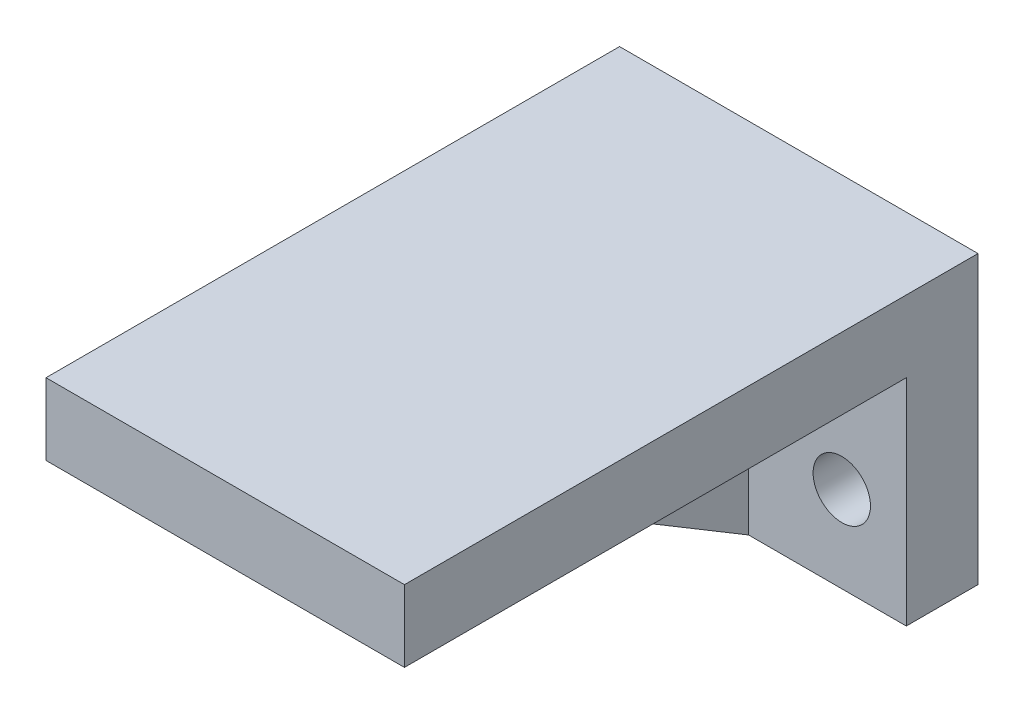
ISO-10303-21;
HEADER;
FILE_DESCRIPTION(('STEP AP214'),'2;1');
FILE_NAME('part.step','',(''),(''),'','','');
FILE_SCHEMA(('AUTOMOTIVE_DESIGN { 1 0 10303 214 1 1 1 1 }'));
ENDSEC;
DATA;
#1=APPLICATION_CONTEXT('core data for automotive mechanical design processes');
#2=APPLICATION_PROTOCOL_DEFINITION('international standard','automotive_design',2000,#1);
#3=PRODUCT_CONTEXT('',#1,'mechanical');
#4=PRODUCT('Part','Part','',(#3));
#5=PRODUCT_RELATED_PRODUCT_CATEGORY('part','',(#4));
#6=PRODUCT_DEFINITION_FORMATION('','',#4);
#7=PRODUCT_DEFINITION_CONTEXT('part definition',#1,'design');
#8=PRODUCT_DEFINITION('design','',#6,#7);
#9=PRODUCT_DEFINITION_SHAPE('','',#8);
#10=(LENGTH_UNIT() NAMED_UNIT(*) SI_UNIT(.MILLI.,.METRE.));
#11=(NAMED_UNIT(*) PLANE_ANGLE_UNIT() SI_UNIT($,.RADIAN.));
#12=(NAMED_UNIT(*) SI_UNIT($,.STERADIAN.) SOLID_ANGLE_UNIT());
#13=UNCERTAINTY_MEASURE_WITH_UNIT(LENGTH_MEASURE(1.E-05),#10,'distance_accuracy_value','');
#14=(GEOMETRIC_REPRESENTATION_CONTEXT(3) GLOBAL_UNCERTAINTY_ASSIGNED_CONTEXT((#13)) GLOBAL_UNIT_ASSIGNED_CONTEXT((#10,
#11,#12)) REPRESENTATION_CONTEXT('',''));
#15=CARTESIAN_POINT('',(0.,0.,0.));
#16=DIRECTION('',(0.,0.,1.));
#17=DIRECTION('',(1.,0.,0.));
#18=AXIS2_PLACEMENT_3D('',#15,#16,#17);
#19=CARTESIAN_POINT('',(12.5,-5.00000000000001,40.));
#20=DIRECTION('',(0.,1.,0.));
#21=DIRECTION('',(0.,0.,1.));
#22=AXIS2_PLACEMENT_3D('',#19,#20,#21);
#23=PLANE('',#22);
#24=DIRECTION('',(0.,0.,1.));
#25=VECTOR('',#24,1.);
#26=CARTESIAN_POINT('',(1.5,-5.00000000000001,5.));
#27=LINE('',#26,#25);
#28=CARTESIAN_POINT('',(1.5,-5.00000000000001,5.));
#29=VERTEX_POINT('',#28);
#30=CARTESIAN_POINT('',(1.5,-5.00000000000001,30.));
#31=VERTEX_POINT('',#30);
#32=EDGE_CURVE('E119',#29,#31,#27,.T.);
#33=ORIENTED_EDGE('',*,*,#32,.F.);
#34=DIRECTION('',(-1.,0.,0.));
#35=VECTOR('',#34,1.);
#36=CARTESIAN_POINT('',(12.5,-5.00000000000001,5.));
#37=LINE('',#36,#35);
#38=CARTESIAN_POINT('',(12.5,-5.00000000000001,5.));
#39=VERTEX_POINT('',#38);
#40=EDGE_CURVE('E116',#39,#29,#37,.T.);
#41=ORIENTED_EDGE('',*,*,#40,.F.);
#42=DIRECTION('',(0.,0.,-1.));
#43=VECTOR('',#42,1.);
#44=CARTESIAN_POINT('',(12.5,-5.00000000000001,40.));
#45=LINE('',#44,#43);
#46=CARTESIAN_POINT('',(12.5,-5.00000000000001,40.));
#47=VERTEX_POINT('',#46);
#48=EDGE_CURVE('E102',#47,#39,#45,.T.);
#49=ORIENTED_EDGE('',*,*,#48,.F.);
#50=DIRECTION('',(-1.,0.,0.));
#51=VECTOR('',#50,1.);
#52=CARTESIAN_POINT('',(12.5,-5.00000000000001,40.));
#53=LINE('',#52,#51);
#54=CARTESIAN_POINT('',(-12.5,-5.00000000000001,40.));
#55=VERTEX_POINT('',#54);
#56=EDGE_CURVE('E122',#47,#55,#53,.T.);
#57=ORIENTED_EDGE('',*,*,#56,.T.);
#58=DIRECTION('',(0.,0.,-1.));
#59=VECTOR('',#58,1.);
#60=CARTESIAN_POINT('',(-12.5,-5.00000000000001,40.));
#61=LINE('',#60,#59);
#62=CARTESIAN_POINT('',(-12.5,-5.00000000000001,5.));
#63=VERTEX_POINT('',#62);
#64=EDGE_CURVE('E141',#55,#63,#61,.T.);
#65=ORIENTED_EDGE('',*,*,#64,.T.);
#66=CARTESIAN_POINT('',(-1.5,-5.00000000000001,5.));
#67=VERTEX_POINT('',#66);
#68=EDGE_CURVE('E123',#67,#63,#37,.T.);
#69=ORIENTED_EDGE('',*,*,#68,.F.);
#70=DIRECTION('',(0.,0.,1.));
#71=VECTOR('',#70,1.);
#72=CARTESIAN_POINT('',(-1.5,-5.00000000000001,5.));
#73=LINE('',#72,#71);
#74=CARTESIAN_POINT('',(-1.5,-5.00000000000001,30.));
#75=VERTEX_POINT('',#74);
#76=EDGE_CURVE('E164',#67,#75,#73,.T.);
#77=ORIENTED_EDGE('',*,*,#76,.T.);
#78=DIRECTION('',(-1.,0.,0.));
#79=VECTOR('',#78,1.);
#80=CARTESIAN_POINT('',(1.5,-5.00000000000001,30.));
#81=LINE('',#80,#79);
#82=EDGE_CURVE('E137',#31,#75,#81,.T.);
#83=ORIENTED_EDGE('',*,*,#82,.F.);
#84=EDGE_LOOP('',(#33,#41,#49,#57,#65,#69,#77,#83));
#85=FACE_BOUND('',#84,.T.);
#86=ADVANCED_FACE('F34',(#85),#23,.F.);
#87=CARTESIAN_POINT('',(12.5,-20.,5.));
#88=DIRECTION('',(0.,0.,-1.));
#89=DIRECTION('',(-1.,0.,0.));
#90=AXIS2_PLACEMENT_3D('',#87,#88,#89);
#91=PLANE('',#90);
#92=CARTESIAN_POINT('',(8.,-14.,5.));
#93=DIRECTION('',(0.,0.,1.));
#94=DIRECTION('',(1.,0.,0.));
#95=AXIS2_PLACEMENT_3D('',#92,#93,#94);
#96=CIRCLE('',#95,2.);
#97=CARTESIAN_POINT('',(10.,-14.,5.));
#98=VERTEX_POINT('',#97);
#99=EDGE_CURVE('E239',#98,#98,#96,.T.);
#100=ORIENTED_EDGE('',*,*,#99,.F.);
#101=EDGE_LOOP('',(#100));
#102=FACE_BOUND('',#101,.T.);
#103=DIRECTION('',(0.,1.,0.));
#104=VECTOR('',#103,1.);
#105=CARTESIAN_POINT('',(1.5,-20.,5.));
#106=LINE('',#105,#104);
#107=CARTESIAN_POINT('',(1.5,-20.,5.));
#108=VERTEX_POINT('',#107);
#109=EDGE_CURVE('E179',#108,#29,#106,.T.);
#110=ORIENTED_EDGE('',*,*,#109,.F.);
#111=DIRECTION('',(-1.,0.,0.));
#112=VECTOR('',#111,1.);
#113=CARTESIAN_POINT('',(12.5,-20.,5.));
#114=LINE('',#113,#112);
#115=CARTESIAN_POINT('',(12.5,-20.,5.));
#116=VERTEX_POINT('',#115);
#117=EDGE_CURVE('E127',#116,#108,#114,.T.);
#118=ORIENTED_EDGE('',*,*,#117,.F.);
#119=DIRECTION('',(0.,-1.,0.));
#120=VECTOR('',#119,1.);
#121=CARTESIAN_POINT('',(12.5,-20.,5.));
#122=LINE('',#121,#120);
#123=EDGE_CURVE('E106',#39,#116,#122,.T.);
#124=ORIENTED_EDGE('',*,*,#123,.F.);
#125=ORIENTED_EDGE('',*,*,#40,.T.);
#126=EDGE_LOOP('',(#110,#118,#124,#125));
#127=FACE_BOUND('',#126,.T.);
#128=ADVANCED_FACE('F125',(#102,#127),#91,.F.);
#129=CARTESIAN_POINT('',(12.5,0.,0.));
#130=DIRECTION('',(0.,0.,1.));
#131=DIRECTION('',(0.,-1.,0.));
#132=AXIS2_PLACEMENT_3D('',#129,#130,#131);
#133=PLANE('',#132);
#134=CARTESIAN_POINT('',(-8.,-14.,0.));
#135=DIRECTION('',(0.,0.,1.));
#136=DIRECTION('',(1.,0.,0.));
#137=AXIS2_PLACEMENT_3D('',#134,#135,#136);
#138=CIRCLE('',#137,2.);
#139=CARTESIAN_POINT('',(-6.,-14.,0.));
#140=VERTEX_POINT('',#139);
#141=EDGE_CURVE('E234',#140,#140,#138,.T.);
#142=ORIENTED_EDGE('',*,*,#141,.T.);
#143=EDGE_LOOP('',(#142));
#144=FACE_BOUND('',#143,.T.);
#145=CARTESIAN_POINT('',(8.,-14.,0.));
#146=DIRECTION('',(0.,0.,1.));
#147=DIRECTION('',(1.,0.,0.));
#148=AXIS2_PLACEMENT_3D('',#145,#146,#147);
#149=CIRCLE('',#148,2.);
#150=CARTESIAN_POINT('',(10.,-14.,0.));
#151=VERTEX_POINT('',#150);
#152=EDGE_CURVE('E242',#151,#151,#149,.T.);
#153=ORIENTED_EDGE('',*,*,#152,.T.);
#154=EDGE_LOOP('',(#153));
#155=FACE_BOUND('',#154,.T.);
#156=DIRECTION('',(0.,1.,0.));
#157=VECTOR('',#156,1.);
#158=CARTESIAN_POINT('',(-12.5,0.,0.));
#159=LINE('',#158,#157);
#160=CARTESIAN_POINT('',(-12.5,-20.,0.));
#161=VERTEX_POINT('',#160);
#162=CARTESIAN_POINT('',(-12.5,0.,0.));
#163=VERTEX_POINT('',#162);
#164=EDGE_CURVE('E133',#161,#163,#159,.T.);
#165=ORIENTED_EDGE('',*,*,#164,.T.);
#166=DIRECTION('',(-1.,0.,0.));
#167=VECTOR('',#166,1.);
#168=CARTESIAN_POINT('',(12.5,0.,0.));
#169=LINE('',#168,#167);
#170=CARTESIAN_POINT('',(12.5,0.,0.));
#171=VERTEX_POINT('',#170);
#172=EDGE_CURVE('E11',#171,#163,#169,.T.);
#173=ORIENTED_EDGE('',*,*,#172,.F.);
#174=DIRECTION('',(0.,1.,0.));
#175=VECTOR('',#174,1.);
#176=CARTESIAN_POINT('',(12.5,0.,0.));
#177=LINE('',#176,#175);
#178=CARTESIAN_POINT('',(12.5,-20.,0.));
#179=VERTEX_POINT('',#178);
#180=EDGE_CURVE('E148',#179,#171,#177,.T.);
#181=ORIENTED_EDGE('',*,*,#180,.F.);
#182=DIRECTION('',(-1.,0.,0.));
#183=VECTOR('',#182,1.);
#184=CARTESIAN_POINT('',(12.5,-20.,0.));
#185=LINE('',#184,#183);
#186=EDGE_CURVE('E129',#179,#161,#185,.T.);
#187=ORIENTED_EDGE('',*,*,#186,.T.);
#188=EDGE_LOOP('',(#165,#173,#181,#187));
#189=FACE_BOUND('',#188,.T.);
#190=ADVANCED_FACE('F36',(#144,#155,#189),#133,.F.);
#191=CARTESIAN_POINT('',(12.5,0.,0.));
#192=DIRECTION('',(0.,-1.,0.));
#193=DIRECTION('',(0.,0.,-1.));
#194=AXIS2_PLACEMENT_3D('',#191,#192,#193);
#195=PLANE('',#194);
#196=DIRECTION('',(0.,0.,1.));
#197=VECTOR('',#196,1.);
#198=CARTESIAN_POINT('',(-12.5,0.,0.));
#199=LINE('',#198,#197);
#200=CARTESIAN_POINT('',(-12.5,0.,40.));
#201=VERTEX_POINT('',#200);
#202=EDGE_CURVE('E136',#163,#201,#199,.T.);
#203=ORIENTED_EDGE('',*,*,#202,.T.);
#204=DIRECTION('',(-1.,0.,0.));
#205=VECTOR('',#204,1.);
#206=CARTESIAN_POINT('',(12.5,0.,40.));
#207=LINE('',#206,#205);
#208=CARTESIAN_POINT('',(12.5,0.,40.));
#209=VERTEX_POINT('',#208);
#210=EDGE_CURVE('E42',#209,#201,#207,.T.);
#211=ORIENTED_EDGE('',*,*,#210,.F.);
#212=DIRECTION('',(0.,0.,1.));
#213=VECTOR('',#212,1.);
#214=CARTESIAN_POINT('',(12.5,0.,0.));
#215=LINE('',#214,#213);
#216=EDGE_CURVE('E92',#171,#209,#215,.T.);
#217=ORIENTED_EDGE('',*,*,#216,.F.);
#218=ORIENTED_EDGE('',*,*,#172,.T.);
#219=EDGE_LOOP('',(#203,#211,#217,#218));
#220=FACE_BOUND('',#219,.T.);
#221=ADVANCED_FACE('F186',(#220),#195,.F.);
#222=CARTESIAN_POINT('',(12.5,0.,40.));
#223=DIRECTION('',(0.,0.,-1.));
#224=DIRECTION('',(-1.,0.,0.));
#225=AXIS2_PLACEMENT_3D('',#222,#223,#224);
#226=PLANE('',#225);
#227=DIRECTION('',(0.,-1.,0.));
#228=VECTOR('',#227,1.);
#229=CARTESIAN_POINT('',(-12.5,0.,40.));
#230=LINE('',#229,#228);
#231=EDGE_CURVE('E139',#201,#55,#230,.T.);
#232=ORIENTED_EDGE('',*,*,#231,.T.);
#233=ORIENTED_EDGE('',*,*,#56,.F.);
#234=DIRECTION('',(0.,-1.,0.));
#235=VECTOR('',#234,1.);
#236=CARTESIAN_POINT('',(12.5,0.,40.));
#237=LINE('',#236,#235);
#238=EDGE_CURVE('E109',#209,#47,#237,.T.);
#239=ORIENTED_EDGE('',*,*,#238,.F.);
#240=ORIENTED_EDGE('',*,*,#210,.T.);
#241=EDGE_LOOP('',(#232,#233,#239,#240));
#242=FACE_BOUND('',#241,.T.);
#243=ADVANCED_FACE('F155',(#242),#226,.F.);
#244=CARTESIAN_POINT('',(-8.,-14.,5.));
#245=DIRECTION('',(0.,0.,1.));
#246=DIRECTION('',(1.,0.,0.));
#247=AXIS2_PLACEMENT_3D('',#244,#245,#246);
#248=CIRCLE('',#247,2.);
#249=CARTESIAN_POINT('',(-6.,-14.,5.));
#250=VERTEX_POINT('',#249);
#251=EDGE_CURVE('E237',#250,#250,#248,.T.);
#252=ORIENTED_EDGE('',*,*,#251,.F.);
#253=EDGE_LOOP('',(#252));
#254=FACE_BOUND('',#253,.T.);
#255=CARTESIAN_POINT('',(-1.5,-20.,5.));
#256=VERTEX_POINT('',#255);
#257=CARTESIAN_POINT('',(-12.5,-20.,5.));
#258=VERTEX_POINT('',#257);
#259=EDGE_CURVE('E150',#256,#258,#114,.T.);
#260=ORIENTED_EDGE('',*,*,#259,.F.);
#261=DIRECTION('',(0.,1.,0.));
#262=VECTOR('',#261,1.);
#263=CARTESIAN_POINT('',(-1.5,-20.,5.));
#264=LINE('',#263,#262);
#265=EDGE_CURVE('E49',#256,#67,#264,.T.);
#266=ORIENTED_EDGE('',*,*,#265,.T.);
#267=ORIENTED_EDGE('',*,*,#68,.T.);
#268=DIRECTION('',(0.,-1.,0.));
#269=VECTOR('',#268,1.);
#270=CARTESIAN_POINT('',(-12.5,-20.,5.));
#271=LINE('',#270,#269);
#272=EDGE_CURVE('E144',#63,#258,#271,.T.);
#273=ORIENTED_EDGE('',*,*,#272,.T.);
#274=EDGE_LOOP('',(#260,#266,#267,#273));
#275=FACE_BOUND('',#274,.T.);
#276=ADVANCED_FACE('F168',(#254,#275),#91,.F.);
#277=CARTESIAN_POINT('',(12.5,-20.,0.));
#278=DIRECTION('',(0.,1.,0.));
#279=DIRECTION('',(0.,0.,1.));
#280=AXIS2_PLACEMENT_3D('',#277,#278,#279);
#281=PLANE('',#280);
#282=DIRECTION('',(0.,0.,-1.));
#283=VECTOR('',#282,1.);
#284=CARTESIAN_POINT('',(-12.5,-20.,0.));
#285=LINE('',#284,#283);
#286=EDGE_CURVE('E84',#258,#161,#285,.T.);
#287=ORIENTED_EDGE('',*,*,#286,.T.);
#288=ORIENTED_EDGE('',*,*,#186,.F.);
#289=DIRECTION('',(0.,0.,-1.));
#290=VECTOR('',#289,1.);
#291=CARTESIAN_POINT('',(12.5,-20.,0.));
#292=LINE('',#291,#290);
#293=EDGE_CURVE('E58',#116,#179,#292,.T.);
#294=ORIENTED_EDGE('',*,*,#293,.F.);
#295=ORIENTED_EDGE('',*,*,#117,.T.);
#296=DIRECTION('',(-1.,0.,0.));
#297=VECTOR('',#296,1.);
#298=CARTESIAN_POINT('',(1.5,-20.,5.));
#299=LINE('',#298,#297);
#300=EDGE_CURVE('E177',#108,#256,#299,.T.);
#301=ORIENTED_EDGE('',*,*,#300,.T.);
#302=ORIENTED_EDGE('',*,*,#259,.T.);
#303=EDGE_LOOP('',(#287,#288,#294,#295,#301,#302));
#304=FACE_BOUND('',#303,.T.);
#305=ADVANCED_FACE('F203',(#304),#281,.F.);
#306=CARTESIAN_POINT('',(12.5,0.,0.));
#307=DIRECTION('',(-1.,0.,0.));
#308=DIRECTION('',(0.,0.,1.));
#309=AXIS2_PLACEMENT_3D('',#306,#307,#308);
#310=PLANE('',#309);
#311=ORIENTED_EDGE('',*,*,#180,.T.);
#312=ORIENTED_EDGE('',*,*,#216,.T.);
#313=ORIENTED_EDGE('',*,*,#238,.T.);
#314=ORIENTED_EDGE('',*,*,#48,.T.);
#315=ORIENTED_EDGE('',*,*,#123,.T.);
#316=ORIENTED_EDGE('',*,*,#293,.T.);
#317=EDGE_LOOP('',(#311,#312,#313,#314,#315,#316));
#318=FACE_BOUND('',#317,.T.);
#319=ADVANCED_FACE('F104',(#318),#310,.F.);
#320=CARTESIAN_POINT('',(-12.5,0.,0.));
#321=DIRECTION('',(-1.,0.,0.));
#322=DIRECTION('',(0.,0.,1.));
#323=AXIS2_PLACEMENT_3D('',#320,#321,#322);
#324=PLANE('',#323);
#325=ORIENTED_EDGE('',*,*,#164,.F.);
#326=ORIENTED_EDGE('',*,*,#286,.F.);
#327=ORIENTED_EDGE('',*,*,#272,.F.);
#328=ORIENTED_EDGE('',*,*,#64,.F.);
#329=ORIENTED_EDGE('',*,*,#231,.F.);
#330=ORIENTED_EDGE('',*,*,#202,.F.);
#331=EDGE_LOOP('',(#325,#326,#327,#328,#329,#330));
#332=FACE_BOUND('',#331,.T.);
#333=ADVANCED_FACE('F159',(#332),#324,.T.);
#334=CARTESIAN_POINT('',(1.5,-5.00000000000001,30.));
#335=DIRECTION('',(0.,0.857492925712544,-0.514495755427526));
#336=DIRECTION('',(0.,0.514495755427526,0.857492925712544));
#337=AXIS2_PLACEMENT_3D('',#334,#335,#336);
#338=PLANE('',#337);
#339=DIRECTION('',(0.,-0.514495755427526,-0.857492925712544));
#340=VECTOR('',#339,1.);
#341=CARTESIAN_POINT('',(-1.5,-5.00000000000001,30.));
#342=LINE('',#341,#340);
#343=EDGE_CURVE('E170',#75,#256,#342,.T.);
#344=ORIENTED_EDGE('',*,*,#343,.T.);
#345=ORIENTED_EDGE('',*,*,#300,.F.);
#346=DIRECTION('',(0.,-0.514495755427526,-0.857492925712544));
#347=VECTOR('',#346,1.);
#348=CARTESIAN_POINT('',(1.5,-5.00000000000001,30.));
#349=LINE('',#348,#347);
#350=EDGE_CURVE('E172',#31,#108,#349,.T.);
#351=ORIENTED_EDGE('',*,*,#350,.F.);
#352=ORIENTED_EDGE('',*,*,#82,.T.);
#353=EDGE_LOOP('',(#344,#345,#351,#352));
#354=FACE_BOUND('',#353,.T.);
#355=ADVANCED_FACE('F209',(#354),#338,.F.);
#356=CARTESIAN_POINT('',(1.5,0.,0.));
#357=DIRECTION('',(-1.,0.,0.));
#358=DIRECTION('',(0.,0.,1.));
#359=AXIS2_PLACEMENT_3D('',#356,#357,#358);
#360=PLANE('',#359);
#361=ORIENTED_EDGE('',*,*,#32,.T.);
#362=ORIENTED_EDGE('',*,*,#350,.T.);
#363=ORIENTED_EDGE('',*,*,#109,.T.);
#364=EDGE_LOOP('',(#361,#362,#363));
#365=FACE_BOUND('',#364,.T.);
#366=ADVANCED_FACE('F214',(#365),#360,.F.);
#367=CARTESIAN_POINT('',(-1.5,0.,0.));
#368=DIRECTION('',(-1.,0.,0.));
#369=DIRECTION('',(0.,0.,1.));
#370=AXIS2_PLACEMENT_3D('',#367,#368,#369);
#371=PLANE('',#370);
#372=ORIENTED_EDGE('',*,*,#76,.F.);
#373=ORIENTED_EDGE('',*,*,#265,.F.);
#374=ORIENTED_EDGE('',*,*,#343,.F.);
#375=EDGE_LOOP('',(#372,#373,#374));
#376=FACE_BOUND('',#375,.T.);
#377=ADVANCED_FACE('F216',(#376),#371,.T.);
#378=CARTESIAN_POINT('',(8.,-14.,0.));
#379=DIRECTION('',(0.,0.,1.));
#380=DIRECTION('',(1.,0.,0.));
#381=AXIS2_PLACEMENT_3D('',#378,#379,#380);
#382=CYLINDRICAL_SURFACE('',#381,2.);
#383=ORIENTED_EDGE('',*,*,#152,.F.);
#384=EDGE_LOOP('',(#383));
#385=FACE_BOUND('',#384,.T.);
#386=ORIENTED_EDGE('',*,*,#99,.T.);
#387=EDGE_LOOP('',(#386));
#388=FACE_BOUND('',#387,.T.);
#389=ADVANCED_FACE('F219',(#385,#388),#382,.F.);
#390=CARTESIAN_POINT('',(-8.,-14.,0.));
#391=DIRECTION('',(0.,0.,1.));
#392=DIRECTION('',(1.,0.,0.));
#393=AXIS2_PLACEMENT_3D('',#390,#391,#392);
#394=CYLINDRICAL_SURFACE('',#393,2.);
#395=ORIENTED_EDGE('',*,*,#141,.F.);
#396=EDGE_LOOP('',(#395));
#397=FACE_BOUND('',#396,.T.);
#398=ORIENTED_EDGE('',*,*,#251,.T.);
#399=EDGE_LOOP('',(#398));
#400=FACE_BOUND('',#399,.T.);
#401=ADVANCED_FACE('F225',(#397,#400),#394,.F.);
#402=CLOSED_SHELL('',(#86,#128,#190,#221,#243,#276,#305,#319,#333,#355,#366,#377,#389,#401));
#403=MANIFOLD_SOLID_BREP('B2',#402);
#404=ADVANCED_BREP_SHAPE_REPRESENTATION('',(#18,#403),#14);
#405=SHAPE_DEFINITION_REPRESENTATION(#9,#404);
ENDSEC;
END-ISO-10303-21;
